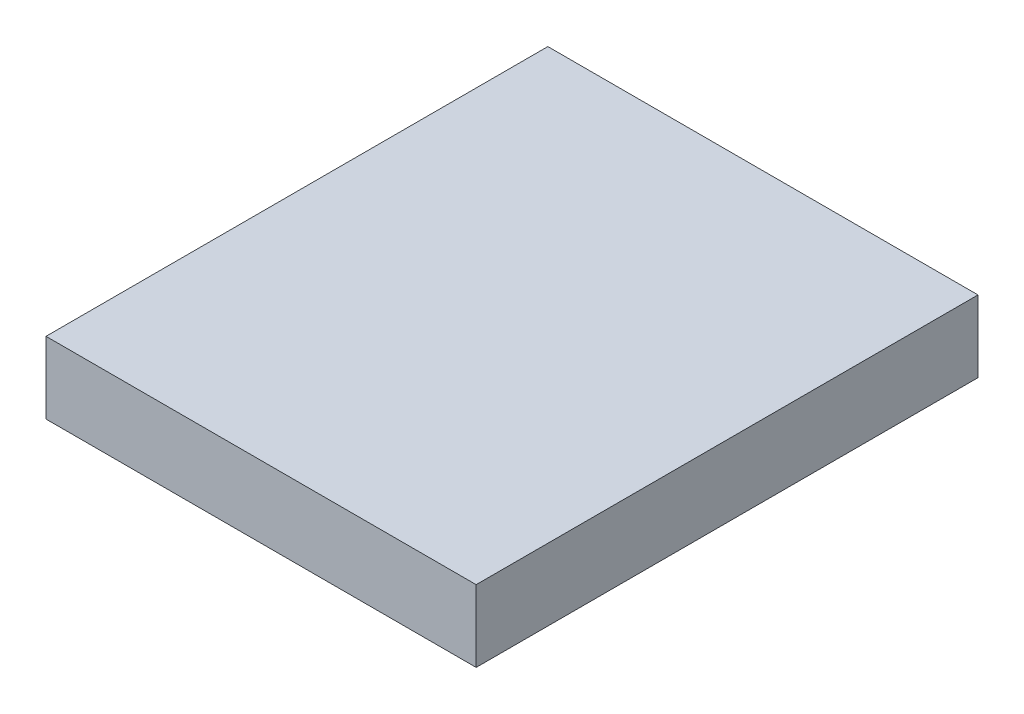
ISO-10303-21;
HEADER;
FILE_DESCRIPTION(('STEP AP214'),'2;1');
FILE_NAME('part.step','',(''),(''),'','','');
FILE_SCHEMA(('AUTOMOTIVE_DESIGN { 1 0 10303 214 1 1 1 1 }'));
ENDSEC;
DATA;
#1=APPLICATION_CONTEXT('core data for automotive mechanical design processes');
#2=APPLICATION_PROTOCOL_DEFINITION('international standard','automotive_design',2000,#1);
#3=PRODUCT_CONTEXT('',#1,'mechanical');
#4=PRODUCT('Part','Part','',(#3));
#5=PRODUCT_RELATED_PRODUCT_CATEGORY('part','',(#4));
#6=PRODUCT_DEFINITION_FORMATION('','',#4);
#7=PRODUCT_DEFINITION_CONTEXT('part definition',#1,'design');
#8=PRODUCT_DEFINITION('design','',#6,#7);
#9=PRODUCT_DEFINITION_SHAPE('','',#8);
#10=(LENGTH_UNIT() NAMED_UNIT(*) SI_UNIT(.MILLI.,.METRE.));
#11=(NAMED_UNIT(*) PLANE_ANGLE_UNIT() SI_UNIT($,.RADIAN.));
#12=(NAMED_UNIT(*) SI_UNIT($,.STERADIAN.) SOLID_ANGLE_UNIT());
#13=UNCERTAINTY_MEASURE_WITH_UNIT(LENGTH_MEASURE(1.E-05),#10,'distance_accuracy_value','');
#14=(GEOMETRIC_REPRESENTATION_CONTEXT(3) GLOBAL_UNCERTAINTY_ASSIGNED_CONTEXT((#13)) GLOBAL_UNIT_ASSIGNED_CONTEXT((#10,
#11,#12)) REPRESENTATION_CONTEXT('',''));
#15=CARTESIAN_POINT('',(0.,0.,0.));
#16=DIRECTION('',(0.,0.,1.));
#17=DIRECTION('',(1.,0.,0.));
#18=AXIS2_PLACEMENT_3D('',#15,#16,#17);
#19=CARTESIAN_POINT('',(15.,5.,17.5));
#20=DIRECTION('',(-1.,0.,0.));
#21=DIRECTION('',(0.,0.,1.));
#22=AXIS2_PLACEMENT_3D('',#19,#20,#21);
#23=PLANE('',#22);
#24=DIRECTION('',(0.,0.,-1.));
#25=VECTOR('',#24,1.);
#26=CARTESIAN_POINT('',(15.,0.,17.5));
#27=LINE('',#26,#25);
#28=CARTESIAN_POINT('',(15.,0.,17.5));
#29=VERTEX_POINT('',#28);
#30=CARTESIAN_POINT('',(15.,0.,-17.5));
#31=VERTEX_POINT('',#30);
#32=EDGE_CURVE('E96',#29,#31,#27,.T.);
#33=ORIENTED_EDGE('',*,*,#32,.T.);
#34=DIRECTION('',(0.,-1.,0.));
#35=VECTOR('',#34,1.);
#36=CARTESIAN_POINT('',(15.,5.,-17.5));
#37=LINE('',#36,#35);
#38=CARTESIAN_POINT('',(15.,5.,-17.5));
#39=VERTEX_POINT('',#38);
#40=EDGE_CURVE('E11',#39,#31,#37,.T.);
#41=ORIENTED_EDGE('',*,*,#40,.F.);
#42=DIRECTION('',(0.,0.,-1.));
#43=VECTOR('',#42,1.);
#44=CARTESIAN_POINT('',(15.,5.,17.5));
#45=LINE('',#44,#43);
#46=CARTESIAN_POINT('',(15.,5.,17.5));
#47=VERTEX_POINT('',#46);
#48=EDGE_CURVE('E84',#47,#39,#45,.T.);
#49=ORIENTED_EDGE('',*,*,#48,.F.);
#50=DIRECTION('',(0.,-1.,0.));
#51=VECTOR('',#50,1.);
#52=CARTESIAN_POINT('',(15.,5.,17.5));
#53=LINE('',#52,#51);
#54=EDGE_CURVE('E92',#47,#29,#53,.T.);
#55=ORIENTED_EDGE('',*,*,#54,.T.);
#56=EDGE_LOOP('',(#33,#41,#49,#55));
#57=FACE_BOUND('',#56,.T.);
#58=ADVANCED_FACE('F33',(#57),#23,.F.);
#59=CARTESIAN_POINT('',(-15.,5.,-17.5));
#60=DIRECTION('',(0.,0.,1.));
#61=DIRECTION('',(1.,0.,0.));
#62=AXIS2_PLACEMENT_3D('',#59,#60,#61);
#63=PLANE('',#62);
#64=DIRECTION('',(-1.,0.,0.));
#65=VECTOR('',#64,1.);
#66=CARTESIAN_POINT('',(-15.,0.,-17.5));
#67=LINE('',#66,#65);
#68=CARTESIAN_POINT('',(-15.,0.,-17.5));
#69=VERTEX_POINT('',#68);
#70=EDGE_CURVE('E88',#31,#69,#67,.T.);
#71=ORIENTED_EDGE('',*,*,#70,.T.);
#72=DIRECTION('',(0.,-1.,0.));
#73=VECTOR('',#72,1.);
#74=CARTESIAN_POINT('',(-15.,5.,-17.5));
#75=LINE('',#74,#73);
#76=CARTESIAN_POINT('',(-15.,5.,-17.5));
#77=VERTEX_POINT('',#76);
#78=EDGE_CURVE('E41',#77,#69,#75,.T.);
#79=ORIENTED_EDGE('',*,*,#78,.F.);
#80=DIRECTION('',(-1.,0.,0.));
#81=VECTOR('',#80,1.);
#82=CARTESIAN_POINT('',(-15.,5.,-17.5));
#83=LINE('',#82,#81);
#84=EDGE_CURVE('E79',#39,#77,#83,.T.);
#85=ORIENTED_EDGE('',*,*,#84,.F.);
#86=ORIENTED_EDGE('',*,*,#40,.T.);
#87=EDGE_LOOP('',(#71,#79,#85,#86));
#88=FACE_BOUND('',#87,.T.);
#89=ADVANCED_FACE('F87',(#88),#63,.F.);
#90=CARTESIAN_POINT('',(-15.,5.,17.5));
#91=DIRECTION('',(1.,0.,0.));
#92=DIRECTION('',(0.,0.,-1.));
#93=AXIS2_PLACEMENT_3D('',#90,#91,#92);
#94=PLANE('',#93);
#95=DIRECTION('',(0.,0.,1.));
#96=VECTOR('',#95,1.);
#97=CARTESIAN_POINT('',(-15.,0.,17.5));
#98=LINE('',#97,#96);
#99=CARTESIAN_POINT('',(-15.,0.,17.5));
#100=VERTEX_POINT('',#99);
#101=EDGE_CURVE('E66',#69,#100,#98,.T.);
#102=ORIENTED_EDGE('',*,*,#101,.T.);
#103=DIRECTION('',(0.,-1.,0.));
#104=VECTOR('',#103,1.);
#105=CARTESIAN_POINT('',(-15.,5.,17.5));
#106=LINE('',#105,#104);
#107=CARTESIAN_POINT('',(-15.,5.,17.5));
#108=VERTEX_POINT('',#107);
#109=EDGE_CURVE('E89',#108,#100,#106,.T.);
#110=ORIENTED_EDGE('',*,*,#109,.F.);
#111=DIRECTION('',(0.,0.,1.));
#112=VECTOR('',#111,1.);
#113=CARTESIAN_POINT('',(-15.,5.,17.5));
#114=LINE('',#113,#112);
#115=EDGE_CURVE('E82',#77,#108,#114,.T.);
#116=ORIENTED_EDGE('',*,*,#115,.F.);
#117=ORIENTED_EDGE('',*,*,#78,.T.);
#118=EDGE_LOOP('',(#102,#110,#116,#117));
#119=FACE_BOUND('',#118,.T.);
#120=ADVANCED_FACE('F90',(#119),#94,.F.);
#121=CARTESIAN_POINT('',(-15.,5.,17.5));
#122=DIRECTION('',(0.,0.,-1.));
#123=DIRECTION('',(-1.,0.,0.));
#124=AXIS2_PLACEMENT_3D('',#121,#122,#123);
#125=PLANE('',#124);
#126=DIRECTION('',(1.,0.,0.));
#127=VECTOR('',#126,1.);
#128=CARTESIAN_POINT('',(-15.,0.,17.5));
#129=LINE('',#128,#127);
#130=EDGE_CURVE('E72',#100,#29,#129,.T.);
#131=ORIENTED_EDGE('',*,*,#130,.T.);
#132=ORIENTED_EDGE('',*,*,#54,.F.);
#133=DIRECTION('',(1.,0.,0.));
#134=VECTOR('',#133,1.);
#135=CARTESIAN_POINT('',(-15.,5.,17.5));
#136=LINE('',#135,#134);
#137=EDGE_CURVE('E49',#108,#47,#136,.T.);
#138=ORIENTED_EDGE('',*,*,#137,.F.);
#139=ORIENTED_EDGE('',*,*,#109,.T.);
#140=EDGE_LOOP('',(#131,#132,#138,#139));
#141=FACE_BOUND('',#140,.T.);
#142=ADVANCED_FACE('F103',(#141),#125,.F.);
#143=CARTESIAN_POINT('',(0.,5.,0.));
#144=DIRECTION('',(0.,-1.,0.));
#145=DIRECTION('',(0.,0.,-1.));
#146=AXIS2_PLACEMENT_3D('',#143,#144,#145);
#147=PLANE('',#146);
#148=ORIENTED_EDGE('',*,*,#48,.T.);
#149=ORIENTED_EDGE('',*,*,#84,.T.);
#150=ORIENTED_EDGE('',*,*,#115,.T.);
#151=ORIENTED_EDGE('',*,*,#137,.T.);
#152=EDGE_LOOP('',(#148,#149,#150,#151));
#153=FACE_BOUND('',#152,.T.);
#154=ADVANCED_FACE('F80',(#153),#147,.F.);
#155=CARTESIAN_POINT('',(0.,0.,0.));
#156=DIRECTION('',(0.,-1.,0.));
#157=DIRECTION('',(0.,0.,-1.));
#158=AXIS2_PLACEMENT_3D('',#155,#156,#157);
#159=PLANE('',#158);
#160=ORIENTED_EDGE('',*,*,#32,.F.);
#161=ORIENTED_EDGE('',*,*,#130,.F.);
#162=ORIENTED_EDGE('',*,*,#101,.F.);
#163=ORIENTED_EDGE('',*,*,#70,.F.);
#164=EDGE_LOOP('',(#160,#161,#162,#163));
#165=FACE_BOUND('',#164,.T.);
#166=ADVANCED_FACE('F106',(#165),#159,.T.);
#167=CLOSED_SHELL('',(#58,#89,#120,#142,#154,#166));
#168=MANIFOLD_SOLID_BREP('B2',#167);
#169=ADVANCED_BREP_SHAPE_REPRESENTATION('',(#18,#168),#14);
#170=SHAPE_DEFINITION_REPRESENTATION(#9,#169);
ENDSEC;
END-ISO-10303-21;
